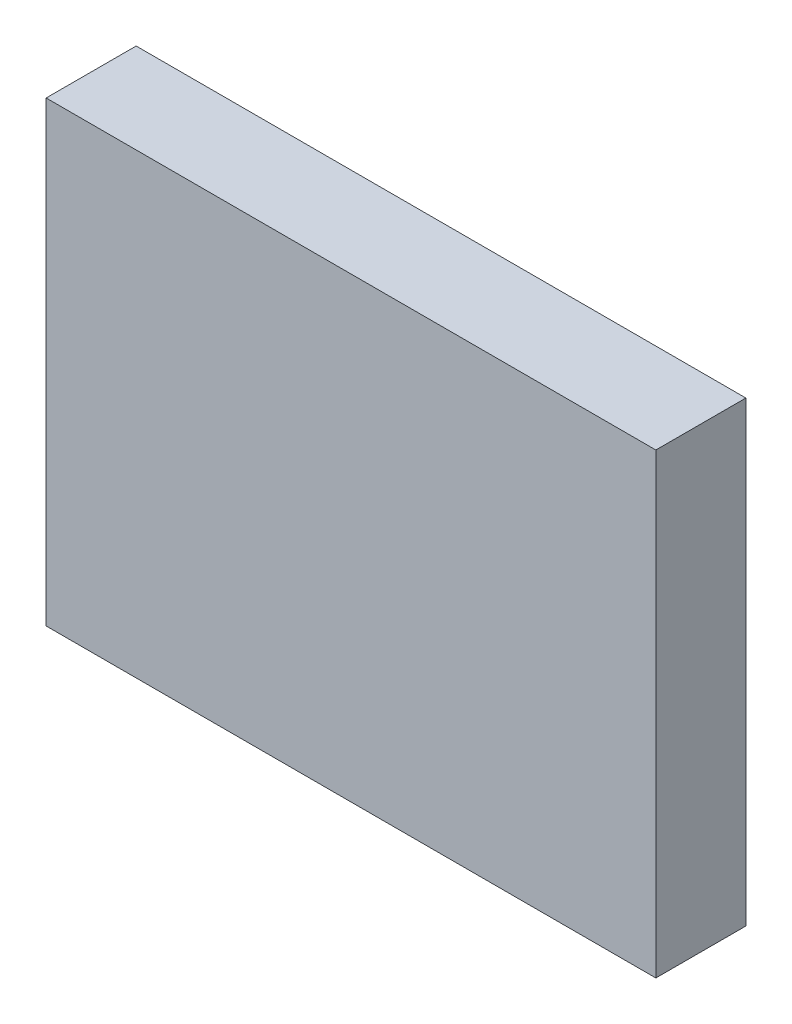
ISO-10303-21;
HEADER;
FILE_DESCRIPTION(('STEP AP214'),'2;1');
FILE_NAME('part.step','',(''),(''),'','','');
FILE_SCHEMA(('AUTOMOTIVE_DESIGN { 1 0 10303 214 1 1 1 1 }'));
ENDSEC;
DATA;
#1=APPLICATION_CONTEXT('core data for automotive mechanical design processes');
#2=APPLICATION_PROTOCOL_DEFINITION('international standard','automotive_design',2000,#1);
#3=PRODUCT_CONTEXT('',#1,'mechanical');
#4=PRODUCT('Part','Part','',(#3));
#5=PRODUCT_RELATED_PRODUCT_CATEGORY('part','',(#4));
#6=PRODUCT_DEFINITION_FORMATION('','',#4);
#7=PRODUCT_DEFINITION_CONTEXT('part definition',#1,'design');
#8=PRODUCT_DEFINITION('design','',#6,#7);
#9=PRODUCT_DEFINITION_SHAPE('','',#8);
#10=(LENGTH_UNIT() NAMED_UNIT(*) SI_UNIT(.MILLI.,.METRE.));
#11=(NAMED_UNIT(*) PLANE_ANGLE_UNIT() SI_UNIT($,.RADIAN.));
#12=(NAMED_UNIT(*) SI_UNIT($,.STERADIAN.) SOLID_ANGLE_UNIT());
#13=UNCERTAINTY_MEASURE_WITH_UNIT(LENGTH_MEASURE(1.E-05),#10,'distance_accuracy_value','');
#14=(GEOMETRIC_REPRESENTATION_CONTEXT(3) GLOBAL_UNCERTAINTY_ASSIGNED_CONTEXT((#13)) GLOBAL_UNIT_ASSIGNED_CONTEXT((#10,
#11,#12)) REPRESENTATION_CONTEXT('',''));
#15=CARTESIAN_POINT('',(0.,0.,0.));
#16=DIRECTION('',(0.,0.,1.));
#17=DIRECTION('',(1.,0.,0.));
#18=AXIS2_PLACEMENT_3D('',#15,#16,#17);
#19=CARTESIAN_POINT('',(0.,0.,15.));
#20=DIRECTION('',(1.,0.,0.));
#21=DIRECTION('',(0.,1.,0.));
#22=AXIS2_PLACEMENT_3D('',#19,#20,#21);
#23=PLANE('',#22);
#24=DIRECTION('',(0.,-1.,0.));
#25=VECTOR('',#24,1.);
#26=CARTESIAN_POINT('',(0.,0.,0.));
#27=LINE('',#26,#25);
#28=CARTESIAN_POINT('',(0.,0.,0.));
#29=VERTEX_POINT('',#28);
#30=CARTESIAN_POINT('',(0.,-76.2,0.));
#31=VERTEX_POINT('',#30);
#32=EDGE_CURVE('E96',#29,#31,#27,.T.);
#33=ORIENTED_EDGE('',*,*,#32,.T.);
#34=DIRECTION('',(0.,0.,-1.));
#35=VECTOR('',#34,1.);
#36=CARTESIAN_POINT('',(0.,-76.2,15.));
#37=LINE('',#36,#35);
#38=CARTESIAN_POINT('',(0.,-76.2,15.));
#39=VERTEX_POINT('',#38);
#40=EDGE_CURVE('E11',#39,#31,#37,.T.);
#41=ORIENTED_EDGE('',*,*,#40,.F.);
#42=DIRECTION('',(0.,-1.,0.));
#43=VECTOR('',#42,1.);
#44=CARTESIAN_POINT('',(0.,0.,15.));
#45=LINE('',#44,#43);
#46=CARTESIAN_POINT('',(0.,0.,15.));
#47=VERTEX_POINT('',#46);
#48=EDGE_CURVE('E84',#47,#39,#45,.T.);
#49=ORIENTED_EDGE('',*,*,#48,.F.);
#50=DIRECTION('',(0.,0.,-1.));
#51=VECTOR('',#50,1.);
#52=CARTESIAN_POINT('',(0.,0.,15.));
#53=LINE('',#52,#51);
#54=EDGE_CURVE('E92',#47,#29,#53,.T.);
#55=ORIENTED_EDGE('',*,*,#54,.T.);
#56=EDGE_LOOP('',(#33,#41,#49,#55));
#57=FACE_BOUND('',#56,.T.);
#58=ADVANCED_FACE('F33',(#57),#23,.F.);
#59=CARTESIAN_POINT('',(0.,-76.2,15.));
#60=DIRECTION('',(0.,1.,0.));
#61=DIRECTION('',(0.,0.,1.));
#62=AXIS2_PLACEMENT_3D('',#59,#60,#61);
#63=PLANE('',#62);
#64=DIRECTION('',(1.,0.,0.));
#65=VECTOR('',#64,1.);
#66=CARTESIAN_POINT('',(0.,-76.2,0.));
#67=LINE('',#66,#65);
#68=CARTESIAN_POINT('',(101.6,-76.2,0.));
#69=VERTEX_POINT('',#68);
#70=EDGE_CURVE('E88',#31,#69,#67,.T.);
#71=ORIENTED_EDGE('',*,*,#70,.T.);
#72=DIRECTION('',(0.,0.,-1.));
#73=VECTOR('',#72,1.);
#74=CARTESIAN_POINT('',(101.6,-76.2,15.));
#75=LINE('',#74,#73);
#76=CARTESIAN_POINT('',(101.6,-76.2,15.));
#77=VERTEX_POINT('',#76);
#78=EDGE_CURVE('E41',#77,#69,#75,.T.);
#79=ORIENTED_EDGE('',*,*,#78,.F.);
#80=DIRECTION('',(1.,0.,0.));
#81=VECTOR('',#80,1.);
#82=CARTESIAN_POINT('',(0.,-76.2,15.));
#83=LINE('',#82,#81);
#84=EDGE_CURVE('E79',#39,#77,#83,.T.);
#85=ORIENTED_EDGE('',*,*,#84,.F.);
#86=ORIENTED_EDGE('',*,*,#40,.T.);
#87=EDGE_LOOP('',(#71,#79,#85,#86));
#88=FACE_BOUND('',#87,.T.);
#89=ADVANCED_FACE('F87',(#88),#63,.F.);
#90=CARTESIAN_POINT('',(101.6,0.,15.));
#91=DIRECTION('',(-1.,0.,0.));
#92=DIRECTION('',(0.,-1.,0.));
#93=AXIS2_PLACEMENT_3D('',#90,#91,#92);
#94=PLANE('',#93);
#95=DIRECTION('',(0.,1.,0.));
#96=VECTOR('',#95,1.);
#97=CARTESIAN_POINT('',(101.6,0.,0.));
#98=LINE('',#97,#96);
#99=CARTESIAN_POINT('',(101.6,0.,0.));
#100=VERTEX_POINT('',#99);
#101=EDGE_CURVE('E66',#69,#100,#98,.T.);
#102=ORIENTED_EDGE('',*,*,#101,.T.);
#103=DIRECTION('',(0.,0.,-1.));
#104=VECTOR('',#103,1.);
#105=CARTESIAN_POINT('',(101.6,0.,15.));
#106=LINE('',#105,#104);
#107=CARTESIAN_POINT('',(101.6,0.,15.));
#108=VERTEX_POINT('',#107);
#109=EDGE_CURVE('E89',#108,#100,#106,.T.);
#110=ORIENTED_EDGE('',*,*,#109,.F.);
#111=DIRECTION('',(0.,1.,0.));
#112=VECTOR('',#111,1.);
#113=CARTESIAN_POINT('',(101.6,0.,15.));
#114=LINE('',#113,#112);
#115=EDGE_CURVE('E82',#77,#108,#114,.T.);
#116=ORIENTED_EDGE('',*,*,#115,.F.);
#117=ORIENTED_EDGE('',*,*,#78,.T.);
#118=EDGE_LOOP('',(#102,#110,#116,#117));
#119=FACE_BOUND('',#118,.T.);
#120=ADVANCED_FACE('F90',(#119),#94,.F.);
#121=CARTESIAN_POINT('',(0.,0.,15.));
#122=DIRECTION('',(0.,-1.,0.));
#123=DIRECTION('',(0.,0.,-1.));
#124=AXIS2_PLACEMENT_3D('',#121,#122,#123);
#125=PLANE('',#124);
#126=DIRECTION('',(-1.,0.,0.));
#127=VECTOR('',#126,1.);
#128=CARTESIAN_POINT('',(0.,0.,0.));
#129=LINE('',#128,#127);
#130=EDGE_CURVE('E72',#100,#29,#129,.T.);
#131=ORIENTED_EDGE('',*,*,#130,.T.);
#132=ORIENTED_EDGE('',*,*,#54,.F.);
#133=DIRECTION('',(-1.,0.,0.));
#134=VECTOR('',#133,1.);
#135=CARTESIAN_POINT('',(0.,0.,15.));
#136=LINE('',#135,#134);
#137=EDGE_CURVE('E49',#108,#47,#136,.T.);
#138=ORIENTED_EDGE('',*,*,#137,.F.);
#139=ORIENTED_EDGE('',*,*,#109,.T.);
#140=EDGE_LOOP('',(#131,#132,#138,#139));
#141=FACE_BOUND('',#140,.T.);
#142=ADVANCED_FACE('F103',(#141),#125,.F.);
#143=CARTESIAN_POINT('',(0.,0.,15.));
#144=DIRECTION('',(0.,0.,1.));
#145=DIRECTION('',(1.,0.,0.));
#146=AXIS2_PLACEMENT_3D('',#143,#144,#145);
#147=PLANE('',#146);
#148=ORIENTED_EDGE('',*,*,#48,.T.);
#149=ORIENTED_EDGE('',*,*,#84,.T.);
#150=ORIENTED_EDGE('',*,*,#115,.T.);
#151=ORIENTED_EDGE('',*,*,#137,.T.);
#152=EDGE_LOOP('',(#148,#149,#150,#151));
#153=FACE_BOUND('',#152,.T.);
#154=ADVANCED_FACE('F80',(#153),#147,.T.);
#155=CARTESIAN_POINT('',(0.,0.,0.));
#156=DIRECTION('',(0.,0.,1.));
#157=DIRECTION('',(1.,0.,0.));
#158=AXIS2_PLACEMENT_3D('',#155,#156,#157);
#159=PLANE('',#158);
#160=ORIENTED_EDGE('',*,*,#32,.F.);
#161=ORIENTED_EDGE('',*,*,#130,.F.);
#162=ORIENTED_EDGE('',*,*,#101,.F.);
#163=ORIENTED_EDGE('',*,*,#70,.F.);
#164=EDGE_LOOP('',(#160,#161,#162,#163));
#165=FACE_BOUND('',#164,.T.);
#166=ADVANCED_FACE('F106',(#165),#159,.F.);
#167=CLOSED_SHELL('',(#58,#89,#120,#142,#154,#166));
#168=MANIFOLD_SOLID_BREP('B2',#167);
#169=ADVANCED_BREP_SHAPE_REPRESENTATION('',(#18,#168),#14);
#170=SHAPE_DEFINITION_REPRESENTATION(#9,#169);
ENDSEC;
END-ISO-10303-21;
